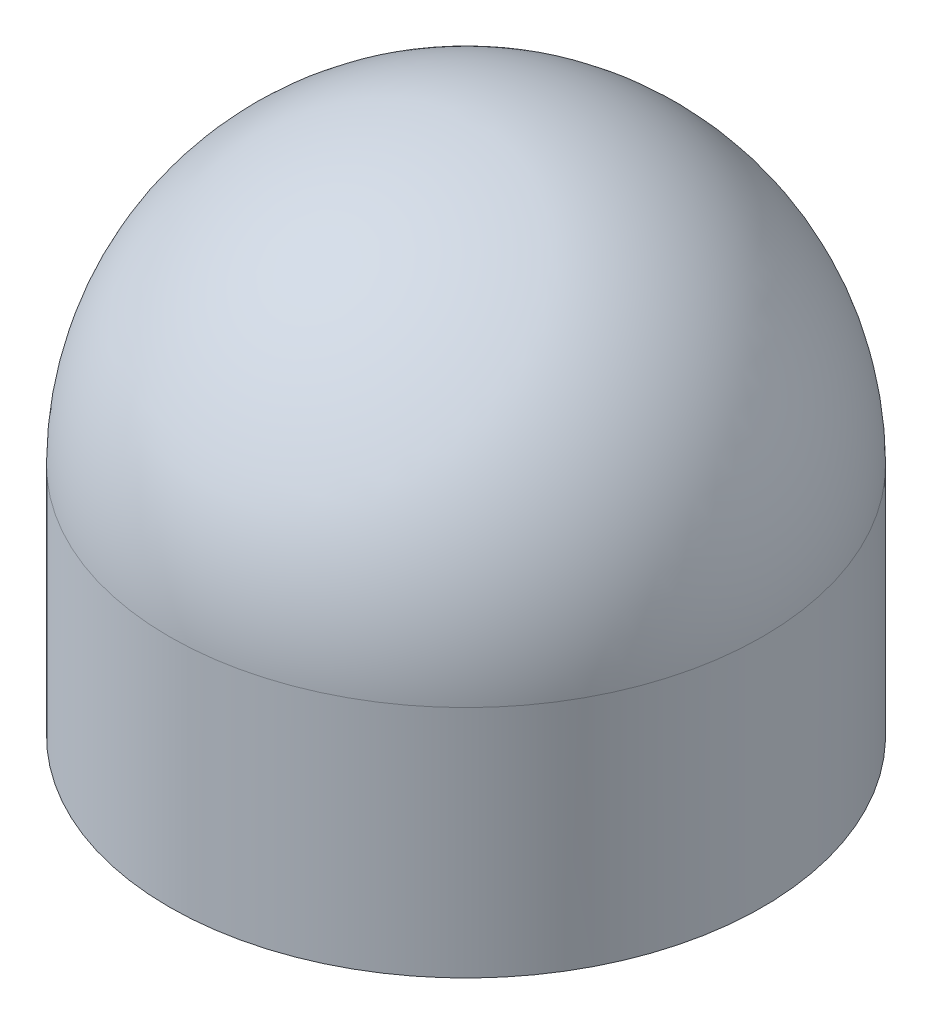
ISO-10303-21;
HEADER;
FILE_DESCRIPTION(('STEP AP214'),'2;1');
FILE_NAME('part.step','',(''),(''),'','','');
FILE_SCHEMA(('AUTOMOTIVE_DESIGN { 1 0 10303 214 1 1 1 1 }'));
ENDSEC;
DATA;
#1=APPLICATION_CONTEXT('core data for automotive mechanical design processes');
#2=APPLICATION_PROTOCOL_DEFINITION('international standard','automotive_design',2000,#1);
#3=PRODUCT_CONTEXT('',#1,'mechanical');
#4=PRODUCT('Part','Part','',(#3));
#5=PRODUCT_RELATED_PRODUCT_CATEGORY('part','',(#4));
#6=PRODUCT_DEFINITION_FORMATION('','',#4);
#7=PRODUCT_DEFINITION_CONTEXT('part definition',#1,'design');
#8=PRODUCT_DEFINITION('design','',#6,#7);
#9=PRODUCT_DEFINITION_SHAPE('','',#8);
#10=(LENGTH_UNIT() NAMED_UNIT(*) SI_UNIT(.MILLI.,.METRE.));
#11=(NAMED_UNIT(*) PLANE_ANGLE_UNIT() SI_UNIT($,.RADIAN.));
#12=(NAMED_UNIT(*) SI_UNIT($,.STERADIAN.) SOLID_ANGLE_UNIT());
#13=UNCERTAINTY_MEASURE_WITH_UNIT(LENGTH_MEASURE(1.E-05),#10,'distance_accuracy_value','');
#14=(GEOMETRIC_REPRESENTATION_CONTEXT(3) GLOBAL_UNCERTAINTY_ASSIGNED_CONTEXT((#13)) GLOBAL_UNIT_ASSIGNED_CONTEXT((#10,
#11,#12)) REPRESENTATION_CONTEXT('',''));
#15=CARTESIAN_POINT('',(0.,0.,0.));
#16=DIRECTION('',(0.,0.,1.));
#17=DIRECTION('',(1.,0.,0.));
#18=AXIS2_PLACEMENT_3D('',#15,#16,#17);
#19=CARTESIAN_POINT('',(0.,0.,0.));
#20=DIRECTION('',(0.,1.,0.));
#21=DIRECTION('',(0.,0.,1.));
#22=AXIS2_PLACEMENT_3D('',#19,#20,#21);
#23=PLANE('',#22);
#24=CARTESIAN_POINT('',(0.,0.,0.));
#25=DIRECTION('',(0.,1.,0.));
#26=DIRECTION('',(0.,0.,1.));
#27=AXIS2_PLACEMENT_3D('',#24,#25,#26);
#28=CIRCLE('',#27,9.652);
#29=CARTESIAN_POINT('',(0.,0.,9.652));
#30=VERTEX_POINT('',#29);
#31=EDGE_CURVE('E10',#30,#30,#28,.T.);
#32=ORIENTED_EDGE('',*,*,#31,.F.);
#33=EDGE_LOOP('',(#32));
#34=FACE_BOUND('',#33,.T.);
#35=ADVANCED_FACE('F41',(#34),#23,.F.);
#36=CARTESIAN_POINT('',(0.,17.272,0.));
#37=DIRECTION('',(0.,1.,0.));
#38=DIRECTION('',(0.,0.,1.));
#39=AXIS2_PLACEMENT_3D('',#36,#37,#38);
#40=CYLINDRICAL_SURFACE('',#39,9.652);
#41=CARTESIAN_POINT('',(0.,7.62,0.));
#42=DIRECTION('',(0.,1.,0.));
#43=DIRECTION('',(0.,0.,1.));
#44=AXIS2_PLACEMENT_3D('',#41,#42,#43);
#45=CIRCLE('',#44,9.652);
#46=CARTESIAN_POINT('',(0.,7.62,9.652));
#47=VERTEX_POINT('',#46);
#48=EDGE_CURVE('E48',#47,#47,#45,.T.);
#49=ORIENTED_EDGE('',*,*,#48,.F.);
#50=EDGE_LOOP('',(#49));
#51=FACE_BOUND('',#50,.T.);
#52=ORIENTED_EDGE('',*,*,#31,.T.);
#53=EDGE_LOOP('',(#52));
#54=FACE_BOUND('',#53,.T.);
#55=ADVANCED_FACE('F57',(#51,#54),#40,.T.);
#56=CARTESIAN_POINT('',(0.,7.62,0.));
#57=DIRECTION('',(0.,1.,0.));
#58=DIRECTION('',(1.,0.,0.));
#59=AXIS2_PLACEMENT_3D('',#56,#57,#58);
#60=SPHERICAL_SURFACE('',#59,9.652);
#61=ORIENTED_EDGE('',*,*,#48,.T.);
#62=EDGE_LOOP('',(#61));
#63=FACE_BOUND('',#62,.T.);
#64=ADVANCED_FACE('F55',(#63),#60,.T.);
#65=CLOSED_SHELL('',(#35,#55,#64));
#66=MANIFOLD_SOLID_BREP('B2',#65);
#67=ADVANCED_BREP_SHAPE_REPRESENTATION('',(#18,#66),#14);
#68=SHAPE_DEFINITION_REPRESENTATION(#9,#67);
ENDSEC;
END-ISO-10303-21;
